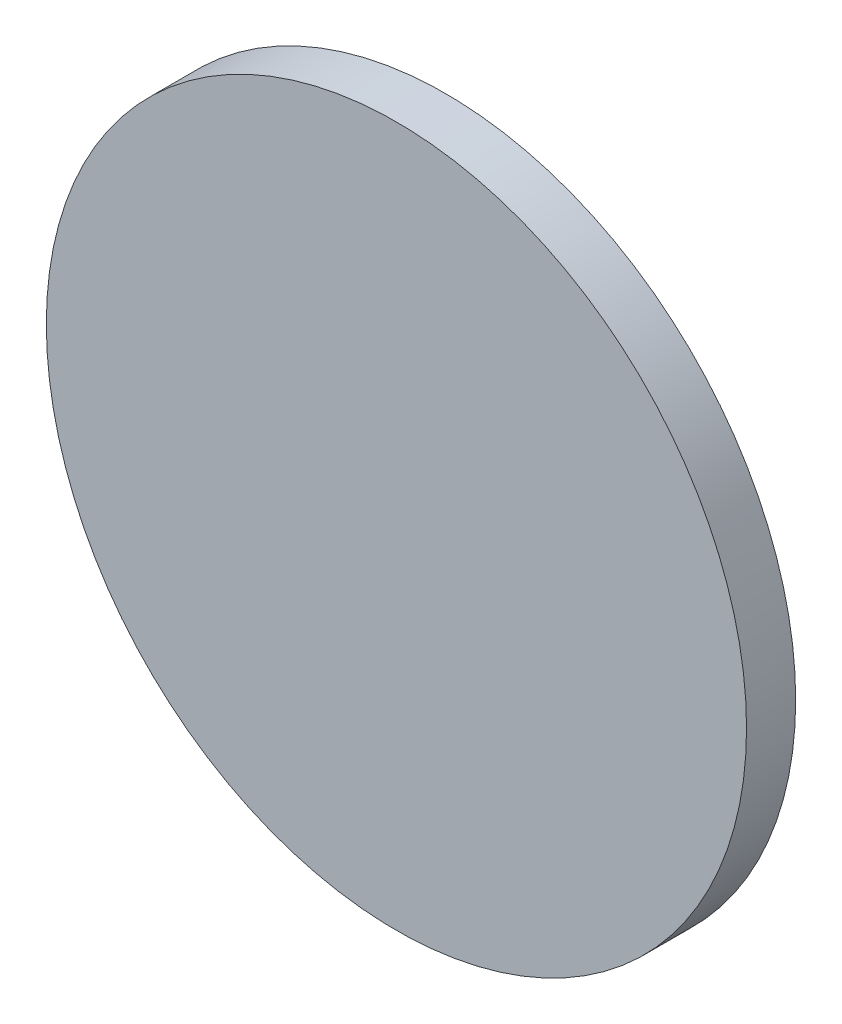
ISO-10303-21;
HEADER;
FILE_DESCRIPTION(('STEP AP214'),'2;1');
FILE_NAME('part.step','',(''),(''),'','','');
FILE_SCHEMA(('AUTOMOTIVE_DESIGN { 1 0 10303 214 1 1 1 1 }'));
ENDSEC;
DATA;
#1=APPLICATION_CONTEXT('core data for automotive mechanical design processes');
#2=APPLICATION_PROTOCOL_DEFINITION('international standard','automotive_design',2000,#1);
#3=PRODUCT_CONTEXT('',#1,'mechanical');
#4=PRODUCT('Part','Part','',(#3));
#5=PRODUCT_RELATED_PRODUCT_CATEGORY('part','',(#4));
#6=PRODUCT_DEFINITION_FORMATION('','',#4);
#7=PRODUCT_DEFINITION_CONTEXT('part definition',#1,'design');
#8=PRODUCT_DEFINITION('design','',#6,#7);
#9=PRODUCT_DEFINITION_SHAPE('','',#8);
#10=(LENGTH_UNIT() NAMED_UNIT(*) SI_UNIT(.MILLI.,.METRE.));
#11=(NAMED_UNIT(*) PLANE_ANGLE_UNIT() SI_UNIT($,.RADIAN.));
#12=(NAMED_UNIT(*) SI_UNIT($,.STERADIAN.) SOLID_ANGLE_UNIT());
#13=UNCERTAINTY_MEASURE_WITH_UNIT(LENGTH_MEASURE(1.E-05),#10,'distance_accuracy_value','');
#14=(GEOMETRIC_REPRESENTATION_CONTEXT(3) GLOBAL_UNCERTAINTY_ASSIGNED_CONTEXT((#13)) GLOBAL_UNIT_ASSIGNED_CONTEXT((#10,
#11,#12)) REPRESENTATION_CONTEXT('',''));
#15=CARTESIAN_POINT('',(0.,0.,0.));
#16=DIRECTION('',(0.,0.,1.));
#17=DIRECTION('',(1.,0.,0.));
#18=AXIS2_PLACEMENT_3D('',#15,#16,#17);
#19=CARTESIAN_POINT('',(0.,0.,4.));
#20=DIRECTION('',(0.,0.,-1.));
#21=DIRECTION('',(-1.,0.,0.));
#22=AXIS2_PLACEMENT_3D('',#19,#20,#21);
#23=CYLINDRICAL_SURFACE('',#22,28.5);
#24=CARTESIAN_POINT('',(0.,0.,4.));
#25=DIRECTION('',(0.,0.,1.));
#26=DIRECTION('',(1.,0.,0.));
#27=AXIS2_PLACEMENT_3D('',#24,#25,#26);
#28=CIRCLE('',#27,28.5);
#29=CARTESIAN_POINT('',(28.5,0.,4.));
#30=VERTEX_POINT('',#29);
#31=EDGE_CURVE('E10',#30,#30,#28,.T.);
#32=ORIENTED_EDGE('',*,*,#31,.F.);
#33=EDGE_LOOP('',(#32));
#34=FACE_BOUND('',#33,.T.);
#35=CARTESIAN_POINT('',(0.,0.,0.));
#36=DIRECTION('',(0.,0.,1.));
#37=DIRECTION('',(1.,0.,0.));
#38=AXIS2_PLACEMENT_3D('',#35,#36,#37);
#39=CIRCLE('',#38,28.5);
#40=CARTESIAN_POINT('',(28.5,0.,0.));
#41=VERTEX_POINT('',#40);
#42=EDGE_CURVE('E35',#41,#41,#39,.T.);
#43=ORIENTED_EDGE('',*,*,#42,.T.);
#44=EDGE_LOOP('',(#43));
#45=FACE_BOUND('',#44,.T.);
#46=ADVANCED_FACE('F32',(#34,#45),#23,.T.);
#47=CARTESIAN_POINT('',(0.,0.,4.));
#48=DIRECTION('',(0.,0.,1.));
#49=DIRECTION('',(1.,0.,0.));
#50=AXIS2_PLACEMENT_3D('',#47,#48,#49);
#51=PLANE('',#50);
#52=ORIENTED_EDGE('',*,*,#31,.T.);
#53=EDGE_LOOP('',(#52));
#54=FACE_BOUND('',#53,.T.);
#55=ADVANCED_FACE('F47',(#54),#51,.T.);
#56=CARTESIAN_POINT('',(0.,0.,0.));
#57=DIRECTION('',(0.,0.,1.));
#58=DIRECTION('',(1.,0.,0.));
#59=AXIS2_PLACEMENT_3D('',#56,#57,#58);
#60=PLANE('',#59);
#61=ORIENTED_EDGE('',*,*,#42,.F.);
#62=EDGE_LOOP('',(#61));
#63=FACE_BOUND('',#62,.T.);
#64=ADVANCED_FACE('F45',(#63),#60,.F.);
#65=CLOSED_SHELL('',(#46,#55,#64));
#66=MANIFOLD_SOLID_BREP('B2',#65);
#67=ADVANCED_BREP_SHAPE_REPRESENTATION('',(#18,#66),#14);
#68=SHAPE_DEFINITION_REPRESENTATION(#9,#67);
ENDSEC;
END-ISO-10303-21;
